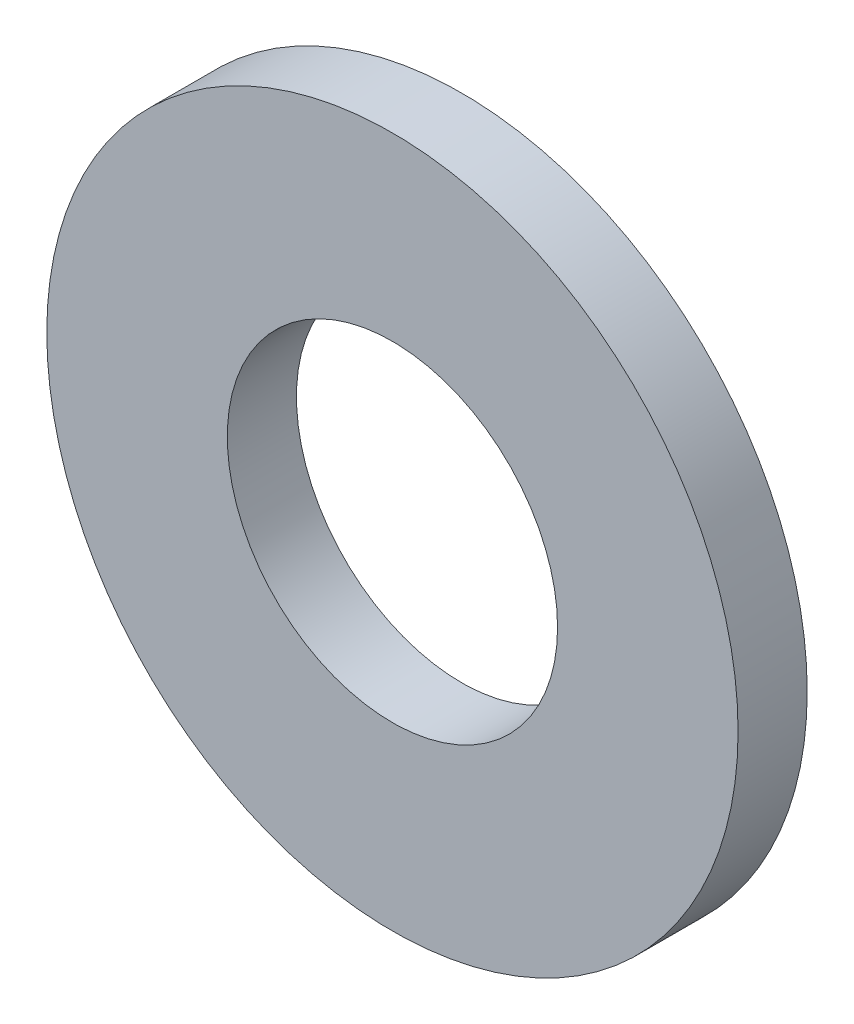
ISO-10303-21;
HEADER;
FILE_DESCRIPTION(('STEP AP214'),'2;1');
FILE_NAME('part.step','',(''),(''),'','','');
FILE_SCHEMA(('AUTOMOTIVE_DESIGN { 1 0 10303 214 1 1 1 1 }'));
ENDSEC;
DATA;
#1=APPLICATION_CONTEXT('core data for automotive mechanical design processes');
#2=APPLICATION_PROTOCOL_DEFINITION('international standard','automotive_design',2000,#1);
#3=PRODUCT_CONTEXT('',#1,'mechanical');
#4=PRODUCT('Part','Part','',(#3));
#5=PRODUCT_RELATED_PRODUCT_CATEGORY('part','',(#4));
#6=PRODUCT_DEFINITION_FORMATION('','',#4);
#7=PRODUCT_DEFINITION_CONTEXT('part definition',#1,'design');
#8=PRODUCT_DEFINITION('design','',#6,#7);
#9=PRODUCT_DEFINITION_SHAPE('','',#8);
#10=(LENGTH_UNIT() NAMED_UNIT(*) SI_UNIT(.MILLI.,.METRE.));
#11=(NAMED_UNIT(*) PLANE_ANGLE_UNIT() SI_UNIT($,.RADIAN.));
#12=(NAMED_UNIT(*) SI_UNIT($,.STERADIAN.) SOLID_ANGLE_UNIT());
#13=UNCERTAINTY_MEASURE_WITH_UNIT(LENGTH_MEASURE(1.E-05),#10,'distance_accuracy_value','');
#14=(GEOMETRIC_REPRESENTATION_CONTEXT(3) GLOBAL_UNCERTAINTY_ASSIGNED_CONTEXT((#13)) GLOBAL_UNIT_ASSIGNED_CONTEXT((#10,
#11,#12)) REPRESENTATION_CONTEXT('',''));
#15=CARTESIAN_POINT('',(0.,0.,0.));
#16=DIRECTION('',(0.,0.,1.));
#17=DIRECTION('',(1.,0.,0.));
#18=AXIS2_PLACEMENT_3D('',#15,#16,#17);
#19=CARTESIAN_POINT('',(0.,0.,0.9));
#20=DIRECTION('',(0.,0.,1.));
#21=DIRECTION('',(1.,0.,0.));
#22=AXIS2_PLACEMENT_3D('',#19,#20,#21);
#23=PLANE('',#22);
#24=CARTESIAN_POINT('',(0.,0.,0.9));
#25=DIRECTION('',(0.,0.,1.));
#26=DIRECTION('',(1.,0.,0.));
#27=AXIS2_PLACEMENT_3D('',#24,#25,#26);
#28=CIRCLE('',#27,4.5);
#29=CARTESIAN_POINT('',(4.5,0.,0.9));
#30=VERTEX_POINT('',#29);
#31=EDGE_CURVE('E10',#30,#30,#28,.T.);
#32=ORIENTED_EDGE('',*,*,#31,.T.);
#33=EDGE_LOOP('',(#32));
#34=FACE_BOUND('',#33,.T.);
#35=CARTESIAN_POINT('',(0.,0.,0.9));
#36=DIRECTION('',(0.,0.,1.));
#37=DIRECTION('',(1.,0.,0.));
#38=AXIS2_PLACEMENT_3D('',#35,#36,#37);
#39=CIRCLE('',#38,2.15);
#40=CARTESIAN_POINT('',(2.15,0.,0.9));
#41=VERTEX_POINT('',#40);
#42=EDGE_CURVE('E44',#41,#41,#39,.T.);
#43=ORIENTED_EDGE('',*,*,#42,.F.);
#44=EDGE_LOOP('',(#43));
#45=FACE_BOUND('',#44,.T.);
#46=ADVANCED_FACE('F33',(#34,#45),#23,.T.);
#47=CARTESIAN_POINT('',(0.,0.,0.));
#48=DIRECTION('',(0.,0.,1.));
#49=DIRECTION('',(1.,0.,0.));
#50=AXIS2_PLACEMENT_3D('',#47,#48,#49);
#51=PLANE('',#50);
#52=CARTESIAN_POINT('',(0.,0.,0.));
#53=DIRECTION('',(0.,0.,1.));
#54=DIRECTION('',(1.,0.,0.));
#55=AXIS2_PLACEMENT_3D('',#52,#53,#54);
#56=CIRCLE('',#55,4.5);
#57=CARTESIAN_POINT('',(4.5,0.,0.));
#58=VERTEX_POINT('',#57);
#59=EDGE_CURVE('E37',#58,#58,#56,.T.);
#60=ORIENTED_EDGE('',*,*,#59,.F.);
#61=EDGE_LOOP('',(#60));
#62=FACE_BOUND('',#61,.T.);
#63=CARTESIAN_POINT('',(0.,0.,0.));
#64=DIRECTION('',(0.,0.,1.));
#65=DIRECTION('',(1.,0.,0.));
#66=AXIS2_PLACEMENT_3D('',#63,#64,#65);
#67=CIRCLE('',#66,2.15);
#68=CARTESIAN_POINT('',(2.15,0.,0.));
#69=VERTEX_POINT('',#68);
#70=EDGE_CURVE('E46',#69,#69,#67,.T.);
#71=ORIENTED_EDGE('',*,*,#70,.T.);
#72=EDGE_LOOP('',(#71));
#73=FACE_BOUND('',#72,.T.);
#74=ADVANCED_FACE('F56',(#62,#73),#51,.F.);
#75=CARTESIAN_POINT('',(0.,0.,0.9));
#76=DIRECTION('',(0.,0.,-1.));
#77=DIRECTION('',(-1.,0.,0.));
#78=AXIS2_PLACEMENT_3D('',#75,#76,#77);
#79=CYLINDRICAL_SURFACE('',#78,4.5);
#80=ORIENTED_EDGE('',*,*,#31,.F.);
#81=EDGE_LOOP('',(#80));
#82=FACE_BOUND('',#81,.T.);
#83=ORIENTED_EDGE('',*,*,#59,.T.);
#84=EDGE_LOOP('',(#83));
#85=FACE_BOUND('',#84,.T.);
#86=ADVANCED_FACE('F35',(#82,#85),#79,.T.);
#87=CARTESIAN_POINT('',(0.,0.,0.9));
#88=DIRECTION('',(0.,0.,-1.));
#89=DIRECTION('',(-1.,0.,0.));
#90=AXIS2_PLACEMENT_3D('',#87,#88,#89);
#91=CYLINDRICAL_SURFACE('',#90,2.15);
#92=ORIENTED_EDGE('',*,*,#42,.T.);
#93=EDGE_LOOP('',(#92));
#94=FACE_BOUND('',#93,.T.);
#95=ORIENTED_EDGE('',*,*,#70,.F.);
#96=EDGE_LOOP('',(#95));
#97=FACE_BOUND('',#96,.T.);
#98=ADVANCED_FACE('F52',(#94,#97),#91,.F.);
#99=CLOSED_SHELL('',(#46,#74,#86,#98));
#100=MANIFOLD_SOLID_BREP('B2',#99);
#101=ADVANCED_BREP_SHAPE_REPRESENTATION('',(#18,#100),#14);
#102=SHAPE_DEFINITION_REPRESENTATION(#9,#101);
ENDSEC;
END-ISO-10303-21;
